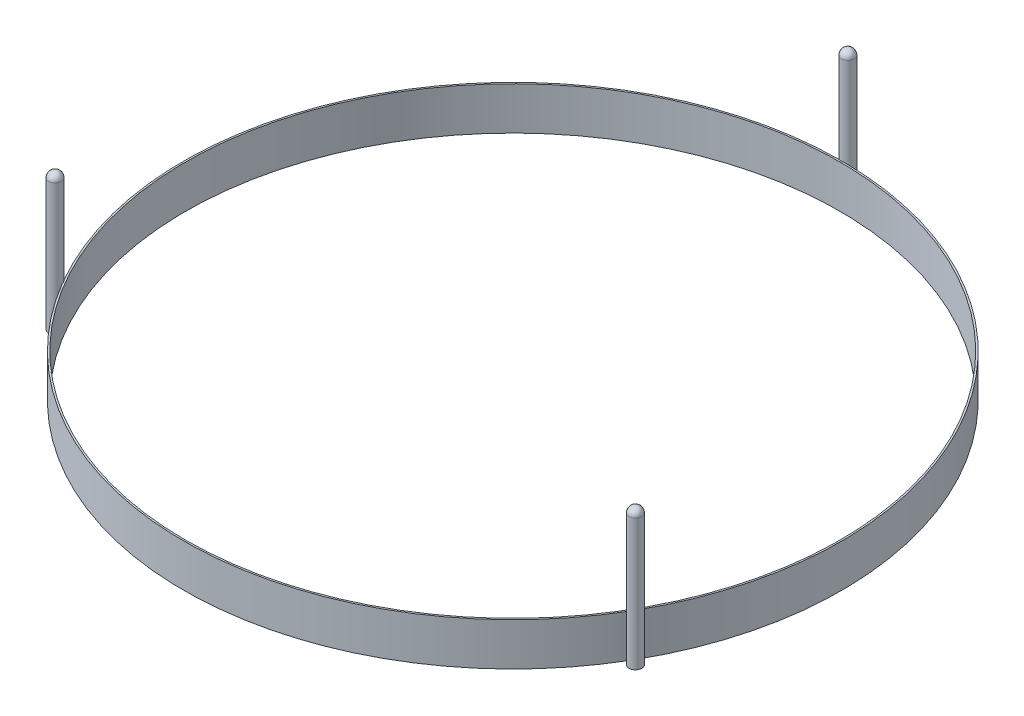
ISO-10303-21;
HEADER;
FILE_DESCRIPTION(('STEP AP214'),'2;1');
FILE_NAME('part.step','',(''),(''),'','','');
FILE_SCHEMA(('AUTOMOTIVE_DESIGN { 1 0 10303 214 1 1 1 1 }'));
ENDSEC;
DATA;
#1=APPLICATION_CONTEXT('core data for automotive mechanical design processes');
#2=APPLICATION_PROTOCOL_DEFINITION('international standard','automotive_design',2000,#1);
#3=PRODUCT_CONTEXT('',#1,'mechanical');
#4=PRODUCT('Part','Part','',(#3));
#5=PRODUCT_RELATED_PRODUCT_CATEGORY('part','',(#4));
#6=PRODUCT_DEFINITION_FORMATION('','',#4);
#7=PRODUCT_DEFINITION_CONTEXT('part definition',#1,'design');
#8=PRODUCT_DEFINITION('design','',#6,#7);
#9=PRODUCT_DEFINITION_SHAPE('','',#8);
#10=(LENGTH_UNIT() NAMED_UNIT(*) SI_UNIT(.MILLI.,.METRE.));
#11=(NAMED_UNIT(*) PLANE_ANGLE_UNIT() SI_UNIT($,.RADIAN.));
#12=(NAMED_UNIT(*) SI_UNIT($,.STERADIAN.) SOLID_ANGLE_UNIT());
#13=UNCERTAINTY_MEASURE_WITH_UNIT(LENGTH_MEASURE(1.E-05),#10,'distance_accuracy_value','');
#14=(GEOMETRIC_REPRESENTATION_CONTEXT(3) GLOBAL_UNCERTAINTY_ASSIGNED_CONTEXT((#13)) GLOBAL_UNIT_ASSIGNED_CONTEXT((#10,
#11,#12)) REPRESENTATION_CONTEXT('',''));
#15=CARTESIAN_POINT('',(0.,0.,0.));
#16=DIRECTION('',(0.,0.,1.));
#17=DIRECTION('',(1.,0.,0.));
#18=AXIS2_PLACEMENT_3D('',#15,#16,#17);
#19=CARTESIAN_POINT('',(0.,5.,0.));
#20=DIRECTION('',(0.,-1.,0.));
#21=DIRECTION('',(0.,0.,-1.));
#22=AXIS2_PLACEMENT_3D('',#19,#20,#21);
#23=CYLINDRICAL_SURFACE('',#22,76.9859221150287);
#24=CARTESIAN_POINT('',(0.,-5.,0.));
#25=DIRECTION('',(0.,1.,0.));
#26=DIRECTION('',(0.,0.,1.));
#27=AXIS2_PLACEMENT_3D('',#24,#25,#26);
#28=CIRCLE('',#27,76.9859221150287);
#29=CARTESIAN_POINT('',(-66.4033210117206,-5.,38.9542188025335));
#30=VERTEX_POINT('',#29);
#31=CARTESIAN_POINT('',(66.4033210117211,-5.,38.9542188025326));
#32=VERTEX_POINT('',#31);
#33=EDGE_CURVE('E104',#30,#32,#28,.T.);
#34=ORIENTED_EDGE('',*,*,#33,.T.);
#35=DIRECTION('',(0.,1.,0.));
#36=VECTOR('',#35,1.);
#37=CARTESIAN_POINT('',(66.4033210117213,10.3721844230057,38.9542188025327));
#38=LINE('',#37,#36);
#39=CARTESIAN_POINT('',(66.4033210117211,5.,38.9542188025326));
#40=VERTEX_POINT('',#39);
#41=EDGE_CURVE('E102',#32,#40,#38,.T.);
#42=ORIENTED_EDGE('',*,*,#41,.T.);
#43=CARTESIAN_POINT('',(0.,5.,0.));
#44=DIRECTION('',(0.,1.,0.));
#45=DIRECTION('',(0.,0.,1.));
#46=AXIS2_PLACEMENT_3D('',#43,#44,#45);
#47=CIRCLE('',#46,76.9859221150287);
#48=CARTESIAN_POINT('',(-66.4033210117206,5.,38.9542188025336));
#49=VERTEX_POINT('',#48);
#50=EDGE_CURVE('E49',#49,#40,#47,.T.);
#51=ORIENTED_EDGE('',*,*,#50,.F.);
#52=DIRECTION('',(0.,1.,0.));
#53=VECTOR('',#52,1.);
#54=CARTESIAN_POINT('',(-66.4033210117208,10.3721844230057,38.9542188025336));
#55=LINE('',#54,#53);
#56=EDGE_CURVE('E131',#49,#30,#55,.F.);
#57=ORIENTED_EDGE('',*,*,#56,.T.);
#58=EDGE_LOOP('',(#34,#42,#51,#57));
#59=FACE_BOUND('',#58,.T.);
#60=ADVANCED_FACE('F39',(#59),#23,.T.);
#61=CARTESIAN_POINT('',(-0.533682561710845,-5.,-76.9840722930698));
#62=VERTEX_POINT('',#61);
#63=CARTESIAN_POINT('',(-66.9370035734314,-5.,38.0298534905369));
#64=VERTEX_POINT('',#63);
#65=EDGE_CURVE('E43',#62,#64,#28,.T.);
#66=ORIENTED_EDGE('',*,*,#65,.T.);
#67=DIRECTION('',(0.,1.,0.));
#68=VECTOR('',#67,1.);
#69=CARTESIAN_POINT('',(-66.9370035734316,10.3721844230057,38.029853490537));
#70=LINE('',#69,#68);
#71=CARTESIAN_POINT('',(-66.9370035734314,5.,38.0298534905369));
#72=VERTEX_POINT('',#71);
#73=EDGE_CURVE('E134',#64,#72,#70,.T.);
#74=ORIENTED_EDGE('',*,*,#73,.T.);
#75=CARTESIAN_POINT('',(-0.533682561710845,5.,-76.9840722930698));
#76=VERTEX_POINT('',#75);
#77=EDGE_CURVE('E11',#76,#72,#47,.T.);
#78=ORIENTED_EDGE('',*,*,#77,.F.);
#79=DIRECTION('',(0.,1.,0.));
#80=VECTOR('',#79,1.);
#81=CARTESIAN_POINT('',(-0.533682561710781,10.3721844230057,-76.9840722930699));
#82=LINE('',#81,#80);
#83=EDGE_CURVE('E150',#76,#62,#82,.F.);
#84=ORIENTED_EDGE('',*,*,#83,.T.);
#85=EDGE_LOOP('',(#66,#74,#78,#84));
#86=FACE_BOUND('',#85,.T.);
#87=ADVANCED_FACE('F173',(#86),#23,.T.);
#88=CARTESIAN_POINT('',(0.,5.,0.));
#89=DIRECTION('',(0.,-1.,0.));
#90=DIRECTION('',(0.,0.,-1.));
#91=AXIS2_PLACEMENT_3D('',#88,#89,#90);
#92=CYLINDRICAL_SURFACE('',#91,76.5859221150287);
#93=CARTESIAN_POINT('',(0.,-5.,0.));
#94=DIRECTION('',(0.,-1.,0.));
#95=DIRECTION('',(0.,0.,1.));
#96=AXIS2_PLACEMENT_3D('',#93,#94,#95);
#97=CIRCLE('',#96,76.5859221150287);
#98=CARTESIAN_POINT('',(0.,-5.,76.5859221150287));
#99=VERTEX_POINT('',#98);
#100=EDGE_CURVE('E158',#99,#99,#97,.T.);
#101=ORIENTED_EDGE('',*,*,#100,.T.);
#102=EDGE_LOOP('',(#101));
#103=FACE_BOUND('',#102,.T.);
#104=CARTESIAN_POINT('',(0.,5.,0.));
#105=DIRECTION('',(0.,-1.,0.));
#106=DIRECTION('',(0.,0.,1.));
#107=AXIS2_PLACEMENT_3D('',#104,#105,#106);
#108=CIRCLE('',#107,76.5859221150287);
#109=CARTESIAN_POINT('',(0.,5.,76.5859221150287));
#110=VERTEX_POINT('',#109);
#111=EDGE_CURVE('E159',#110,#110,#108,.T.);
#112=ORIENTED_EDGE('',*,*,#111,.F.);
#113=EDGE_LOOP('',(#112));
#114=FACE_BOUND('',#113,.T.);
#115=ADVANCED_FACE('F41',(#103,#114),#92,.F.);
#116=CARTESIAN_POINT('',(66.937003573432,5.,38.0298534905359));
#117=VERTEX_POINT('',#116);
#118=CARTESIAN_POINT('',(0.533682561710845,5.,-76.9840722930698));
#119=VERTEX_POINT('',#118);
#120=EDGE_CURVE('E51',#117,#119,#47,.T.);
#121=ORIENTED_EDGE('',*,*,#120,.F.);
#122=DIRECTION('',(0.,1.,0.));
#123=VECTOR('',#122,1.);
#124=CARTESIAN_POINT('',(66.9370035734321,10.3721844230057,38.0298534905361));
#125=LINE('',#124,#123);
#126=CARTESIAN_POINT('',(66.937003573432,-5.,38.0298534905359));
#127=VERTEX_POINT('',#126);
#128=EDGE_CURVE('E65',#117,#127,#125,.F.);
#129=ORIENTED_EDGE('',*,*,#128,.T.);
#130=CARTESIAN_POINT('',(0.533682561710845,-5.,-76.9840722930698));
#131=VERTEX_POINT('',#130);
#132=EDGE_CURVE('E164',#127,#131,#28,.T.);
#133=ORIENTED_EDGE('',*,*,#132,.T.);
#134=DIRECTION('',(0.,1.,0.));
#135=VECTOR('',#134,1.);
#136=CARTESIAN_POINT('',(0.533682561710781,10.3721844230057,-76.9840722930699));
#137=LINE('',#136,#135);
#138=EDGE_CURVE('E154',#131,#119,#137,.T.);
#139=ORIENTED_EDGE('',*,*,#138,.T.);
#140=EDGE_LOOP('',(#121,#129,#133,#139));
#141=FACE_BOUND('',#140,.T.);
#142=ADVANCED_FACE('F184',(#141),#23,.T.);
#143=CARTESIAN_POINT('',(0.,5.,0.));
#144=DIRECTION('',(0.,1.,0.));
#145=DIRECTION('',(0.,0.,1.));
#146=AXIS2_PLACEMENT_3D('',#143,#144,#145);
#147=PLANE('',#146);
#148=CARTESIAN_POINT('',(67.8841998506837,5.,39.1929610575137));
#149=DIRECTION('',(0.,1.,0.));
#150=DIRECTION('',(0.,0.,1.));
#151=AXIS2_PLACEMENT_3D('',#148,#149,#150);
#152=CIRCLE('',#151,1.50000000000001);
#153=EDGE_CURVE('E58',#117,#40,#152,.T.);
#154=ORIENTED_EDGE('',*,*,#153,.F.);
#155=ORIENTED_EDGE('',*,*,#120,.T.);
#156=CARTESIAN_POINT('',(0.,5.,-78.3859221150287));
#157=DIRECTION('',(0.,1.,0.));
#158=DIRECTION('',(0.,0.,1.));
#159=AXIS2_PLACEMENT_3D('',#156,#157,#158);
#160=CIRCLE('',#159,1.50000000000001);
#161=EDGE_CURVE('E146',#76,#119,#160,.T.);
#162=ORIENTED_EDGE('',*,*,#161,.F.);
#163=ORIENTED_EDGE('',*,*,#77,.T.);
#164=CARTESIAN_POINT('',(-67.8841998506831,5.,39.1929610575147));
#165=DIRECTION('',(0.,1.,0.));
#166=DIRECTION('',(0.,0.,1.));
#167=AXIS2_PLACEMENT_3D('',#164,#165,#166);
#168=CIRCLE('',#167,1.50000000000001);
#169=EDGE_CURVE('E97',#49,#72,#168,.T.);
#170=ORIENTED_EDGE('',*,*,#169,.F.);
#171=ORIENTED_EDGE('',*,*,#50,.T.);
#172=EDGE_LOOP('',(#154,#155,#162,#163,#170,#171));
#173=FACE_BOUND('',#172,.T.);
#174=ORIENTED_EDGE('',*,*,#111,.T.);
#175=EDGE_LOOP('',(#174));
#176=FACE_BOUND('',#175,.T.);
#177=ADVANCED_FACE('F94',(#173,#176),#147,.T.);
#178=CARTESIAN_POINT('',(0.,-5.,0.));
#179=DIRECTION('',(0.,1.,0.));
#180=DIRECTION('',(0.,0.,1.));
#181=AXIS2_PLACEMENT_3D('',#178,#179,#180);
#182=PLANE('',#181);
#183=ORIENTED_EDGE('',*,*,#100,.F.);
#184=EDGE_LOOP('',(#183));
#185=FACE_BOUND('',#184,.T.);
#186=ORIENTED_EDGE('',*,*,#132,.F.);
#187=CARTESIAN_POINT('',(67.8841998506837,-5.,39.1929610575137));
#188=DIRECTION('',(0.,1.,0.));
#189=DIRECTION('',(-0.866025403784443,0.,-0.499999999999992));
#190=AXIS2_PLACEMENT_3D('',#187,#188,#189);
#191=CIRCLE('',#190,1.50000000000001);
#192=EDGE_CURVE('E113',#32,#127,#191,.T.);
#193=ORIENTED_EDGE('',*,*,#192,.F.);
#194=ORIENTED_EDGE('',*,*,#33,.F.);
#195=CARTESIAN_POINT('',(-67.8841998506832,-5.,39.1929610575147));
#196=DIRECTION('',(0.,1.,0.));
#197=DIRECTION('',(0.866025403784436,0.,-0.500000000000004));
#198=AXIS2_PLACEMENT_3D('',#195,#196,#197);
#199=CIRCLE('',#198,1.50000000000001);
#200=EDGE_CURVE('E125',#64,#30,#199,.T.);
#201=ORIENTED_EDGE('',*,*,#200,.F.);
#202=ORIENTED_EDGE('',*,*,#65,.F.);
#203=CARTESIAN_POINT('',(0.,-5.,-78.3859221150287));
#204=DIRECTION('',(0.,1.,0.));
#205=DIRECTION('',(0.,0.,1.));
#206=AXIS2_PLACEMENT_3D('',#203,#204,#205);
#207=CIRCLE('',#206,1.50000000000001);
#208=EDGE_CURVE('E142',#131,#62,#207,.T.);
#209=ORIENTED_EDGE('',*,*,#208,.F.);
#210=EDGE_LOOP('',(#186,#193,#194,#201,#202,#209));
#211=FACE_BOUND('',#210,.T.);
#212=ADVANCED_FACE('F180',(#185,#211),#182,.F.);
#213=CARTESIAN_POINT('',(0.,25.7443688460115,-78.3859221150287));
#214=DIRECTION('',(0.,1.,0.));
#215=DIRECTION('',(0.,0.,1.));
#216=AXIS2_PLACEMENT_3D('',#213,#214,#215);
#217=CYLINDRICAL_SURFACE('',#216,1.50000000000001);
#218=CARTESIAN_POINT('',(0.,25.7443688460115,-78.3859221150287));
#219=DIRECTION('',(0.,1.,0.));
#220=DIRECTION('',(0.,0.,1.));
#221=AXIS2_PLACEMENT_3D('',#218,#219,#220);
#222=CIRCLE('',#221,1.5);
#223=CARTESIAN_POINT('',(0.,25.7443688460115,-76.8859221150287));
#224=VERTEX_POINT('',#223);
#225=EDGE_CURVE('E138',#224,#224,#222,.T.);
#226=ORIENTED_EDGE('',*,*,#225,.F.);
#227=EDGE_LOOP('',(#226));
#228=FACE_BOUND('',#227,.T.);
#229=ORIENTED_EDGE('',*,*,#138,.F.);
#230=ORIENTED_EDGE('',*,*,#208,.T.);
#231=ORIENTED_EDGE('',*,*,#83,.F.);
#232=ORIENTED_EDGE('',*,*,#161,.T.);
#233=EDGE_LOOP('',(#229,#230,#231,#232));
#234=FACE_BOUND('',#233,.T.);
#235=ADVANCED_FACE('F182',(#228,#234),#217,.T.);
#236=CARTESIAN_POINT('',(0.,25.7443688460115,-78.3859221150287));
#237=DIRECTION('',(0.,1.,0.));
#238=DIRECTION('',(0.,0.,-1.));
#239=AXIS2_PLACEMENT_3D('',#236,#237,#238);
#240=SPHERICAL_SURFACE('',#239,1.5);
#241=ORIENTED_EDGE('',*,*,#225,.T.);
#242=EDGE_LOOP('',(#241));
#243=FACE_BOUND('',#242,.T.);
#244=ADVANCED_FACE('F238',(#243),#240,.T.);
#245=CARTESIAN_POINT('',(-67.8841998506831,25.7443688460115,39.1929610575147));
#246=DIRECTION('',(0.,1.,0.));
#247=DIRECTION('',(0.866025403784436,0.,-0.500000000000004));
#248=AXIS2_PLACEMENT_3D('',#245,#246,#247);
#249=CYLINDRICAL_SURFACE('',#248,1.50000000000001);
#250=CARTESIAN_POINT('',(-67.8841998506831,25.7443688460115,39.1929610575147));
#251=DIRECTION('',(0.,1.,0.));
#252=DIRECTION('',(0.866025403784436,0.,-0.500000000000004));
#253=AXIS2_PLACEMENT_3D('',#250,#251,#252);
#254=CIRCLE('',#253,1.5);
#255=CARTESIAN_POINT('',(-66.5851617450065,25.7443688460115,38.4429610575147));
#256=VERTEX_POINT('',#255);
#257=EDGE_CURVE('E109',#256,#256,#254,.T.);
#258=ORIENTED_EDGE('',*,*,#257,.F.);
#259=EDGE_LOOP('',(#258));
#260=FACE_BOUND('',#259,.T.);
#261=ORIENTED_EDGE('',*,*,#73,.F.);
#262=ORIENTED_EDGE('',*,*,#200,.T.);
#263=ORIENTED_EDGE('',*,*,#56,.F.);
#264=ORIENTED_EDGE('',*,*,#169,.T.);
#265=EDGE_LOOP('',(#261,#262,#263,#264));
#266=FACE_BOUND('',#265,.T.);
#267=ADVANCED_FACE('F179',(#260,#266),#249,.T.);
#268=CARTESIAN_POINT('',(-67.8841998506831,25.7443688460115,39.1929610575147));
#269=DIRECTION('',(0.,1.,0.));
#270=DIRECTION('',(-0.866025403784436,0.,0.500000000000004));
#271=AXIS2_PLACEMENT_3D('',#268,#269,#270);
#272=SPHERICAL_SURFACE('',#271,1.5);
#273=ORIENTED_EDGE('',*,*,#257,.T.);
#274=EDGE_LOOP('',(#273));
#275=FACE_BOUND('',#274,.T.);
#276=ADVANCED_FACE('F237',(#275),#272,.T.);
#277=CARTESIAN_POINT('',(67.8841998506837,25.7443688460115,39.1929610575137));
#278=DIRECTION('',(0.,1.,0.));
#279=DIRECTION('',(-0.866025403784443,0.,-0.499999999999992));
#280=AXIS2_PLACEMENT_3D('',#277,#278,#279);
#281=CYLINDRICAL_SURFACE('',#280,1.50000000000001);
#282=CARTESIAN_POINT('',(67.8841998506837,25.7443688460115,39.1929610575137));
#283=DIRECTION('',(0.,1.,0.));
#284=DIRECTION('',(-0.866025403784443,0.,-0.499999999999992));
#285=AXIS2_PLACEMENT_3D('',#282,#283,#284);
#286=CIRCLE('',#285,1.5);
#287=CARTESIAN_POINT('',(66.585161745007,25.7443688460115,38.4429610575137));
#288=VERTEX_POINT('',#287);
#289=EDGE_CURVE('E118',#288,#288,#286,.T.);
#290=ORIENTED_EDGE('',*,*,#289,.F.);
#291=EDGE_LOOP('',(#290));
#292=FACE_BOUND('',#291,.T.);
#293=ORIENTED_EDGE('',*,*,#41,.F.);
#294=ORIENTED_EDGE('',*,*,#192,.T.);
#295=ORIENTED_EDGE('',*,*,#128,.F.);
#296=ORIENTED_EDGE('',*,*,#153,.T.);
#297=EDGE_LOOP('',(#293,#294,#295,#296));
#298=FACE_BOUND('',#297,.T.);
#299=ADVANCED_FACE('F111',(#292,#298),#281,.T.);
#300=CARTESIAN_POINT('',(67.8841998506837,25.7443688460115,39.1929610575137));
#301=DIRECTION('',(0.,1.,0.));
#302=DIRECTION('',(0.866025403784443,0.,0.499999999999992));
#303=AXIS2_PLACEMENT_3D('',#300,#301,#302);
#304=SPHERICAL_SURFACE('',#303,1.5);
#305=ORIENTED_EDGE('',*,*,#289,.T.);
#306=EDGE_LOOP('',(#305));
#307=FACE_BOUND('',#306,.T.);
#308=ADVANCED_FACE('F258',(#307),#304,.T.);
#309=CLOSED_SHELL('',(#60,#87,#115,#142,#177,#212,#235,#244,#267,#276,#299,#308));
#310=MANIFOLD_SOLID_BREP('B2',#309);
#311=ADVANCED_BREP_SHAPE_REPRESENTATION('',(#18,#310),#14);
#312=SHAPE_DEFINITION_REPRESENTATION(#9,#311);
ENDSEC;
END-ISO-10303-21;
